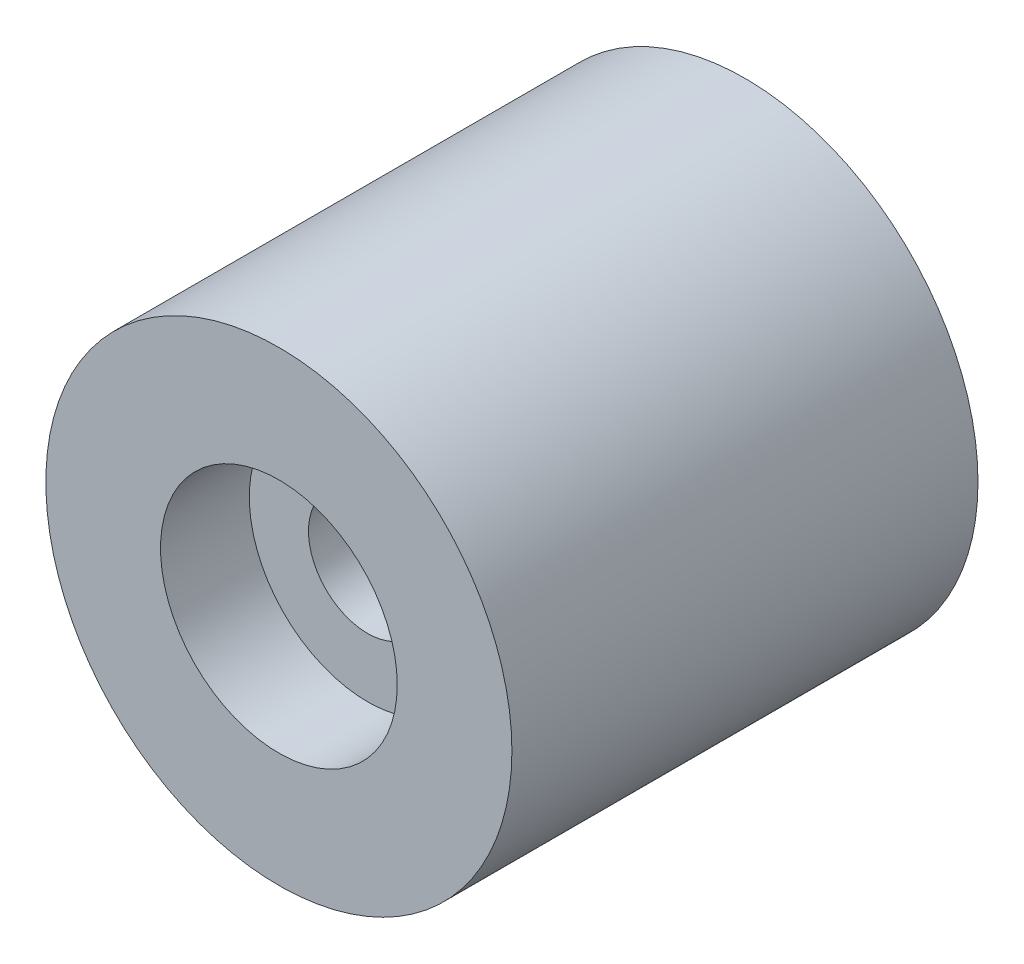
ISO-10303-21;
HEADER;
FILE_DESCRIPTION(('STEP AP214'),'2;1');
FILE_NAME('part.step','',(''),(''),'','','');
FILE_SCHEMA(('AUTOMOTIVE_DESIGN { 1 0 10303 214 1 1 1 1 }'));
ENDSEC;
DATA;
#1=APPLICATION_CONTEXT('core data for automotive mechanical design processes');
#2=APPLICATION_PROTOCOL_DEFINITION('international standard','automotive_design',2000,#1);
#3=PRODUCT_CONTEXT('',#1,'mechanical');
#4=PRODUCT('Part','Part','',(#3));
#5=PRODUCT_RELATED_PRODUCT_CATEGORY('part','',(#4));
#6=PRODUCT_DEFINITION_FORMATION('','',#4);
#7=PRODUCT_DEFINITION_CONTEXT('part definition',#1,'design');
#8=PRODUCT_DEFINITION('design','',#6,#7);
#9=PRODUCT_DEFINITION_SHAPE('','',#8);
#10=(LENGTH_UNIT() NAMED_UNIT(*) SI_UNIT(.MILLI.,.METRE.));
#11=(NAMED_UNIT(*) PLANE_ANGLE_UNIT() SI_UNIT($,.RADIAN.));
#12=(NAMED_UNIT(*) SI_UNIT($,.STERADIAN.) SOLID_ANGLE_UNIT());
#13=UNCERTAINTY_MEASURE_WITH_UNIT(LENGTH_MEASURE(1.E-05),#10,'distance_accuracy_value','');
#14=(GEOMETRIC_REPRESENTATION_CONTEXT(3) GLOBAL_UNCERTAINTY_ASSIGNED_CONTEXT((#13)) GLOBAL_UNIT_ASSIGNED_CONTEXT((#10,
#11,#12)) REPRESENTATION_CONTEXT('',''));
#15=CARTESIAN_POINT('',(0.,0.,0.));
#16=DIRECTION('',(0.,0.,1.));
#17=DIRECTION('',(1.,0.,0.));
#18=AXIS2_PLACEMENT_3D('',#15,#16,#17);
#19=CARTESIAN_POINT('',(0.,0.,15.75));
#20=DIRECTION('',(0.,0.,-1.));
#21=DIRECTION('',(-1.,0.,0.));
#22=AXIS2_PLACEMENT_3D('',#19,#20,#21);
#23=CYLINDRICAL_SURFACE('',#22,2.);
#24=CARTESIAN_POINT('',(0.,0.,0.));
#25=DIRECTION('',(0.,0.,1.));
#26=DIRECTION('',(1.,0.,0.));
#27=AXIS2_PLACEMENT_3D('',#24,#25,#26);
#28=CIRCLE('',#27,2.);
#29=CARTESIAN_POINT('',(2.,0.,0.));
#30=VERTEX_POINT('',#29);
#31=EDGE_CURVE('E50',#30,#30,#28,.T.);
#32=ORIENTED_EDGE('',*,*,#31,.F.);
#33=EDGE_LOOP('',(#32));
#34=FACE_BOUND('',#33,.T.);
#35=CARTESIAN_POINT('',(0.,0.,12.75));
#36=DIRECTION('',(0.,0.,1.));
#37=DIRECTION('',(1.,0.,0.));
#38=AXIS2_PLACEMENT_3D('',#35,#36,#37);
#39=CIRCLE('',#38,2.);
#40=CARTESIAN_POINT('',(2.,0.,12.75));
#41=VERTEX_POINT('',#40);
#42=EDGE_CURVE('E41',#41,#41,#39,.T.);
#43=ORIENTED_EDGE('',*,*,#42,.T.);
#44=EDGE_LOOP('',(#43));
#45=FACE_BOUND('',#44,.T.);
#46=ADVANCED_FACE('F37',(#34,#45),#23,.F.);
#47=CARTESIAN_POINT('',(0.,0.,15.75));
#48=DIRECTION('',(0.,0.,1.));
#49=DIRECTION('',(1.,0.,0.));
#50=AXIS2_PLACEMENT_3D('',#47,#48,#49);
#51=PLANE('',#50);
#52=CARTESIAN_POINT('',(0.,0.,15.75));
#53=DIRECTION('',(0.,0.,1.));
#54=DIRECTION('',(1.,0.,0.));
#55=AXIS2_PLACEMENT_3D('',#52,#53,#54);
#56=CIRCLE('',#55,4.);
#57=CARTESIAN_POINT('',(4.,0.,15.75));
#58=VERTEX_POINT('',#57);
#59=EDGE_CURVE('E54',#58,#58,#56,.T.);
#60=ORIENTED_EDGE('',*,*,#59,.F.);
#61=EDGE_LOOP('',(#60));
#62=FACE_BOUND('',#61,.T.);
#63=CARTESIAN_POINT('',(0.,0.,15.75));
#64=DIRECTION('',(0.,0.,1.));
#65=DIRECTION('',(1.,0.,0.));
#66=AXIS2_PLACEMENT_3D('',#63,#64,#65);
#67=CIRCLE('',#66,7.875);
#68=CARTESIAN_POINT('',(7.875,0.,15.75));
#69=VERTEX_POINT('',#68);
#70=EDGE_CURVE('E10',#69,#69,#67,.T.);
#71=ORIENTED_EDGE('',*,*,#70,.T.);
#72=EDGE_LOOP('',(#71));
#73=FACE_BOUND('',#72,.T.);
#74=ADVANCED_FACE('F75',(#62,#73),#51,.T.);
#75=CARTESIAN_POINT('',(0.,0.,0.));
#76=DIRECTION('',(0.,0.,1.));
#77=DIRECTION('',(1.,0.,0.));
#78=AXIS2_PLACEMENT_3D('',#75,#76,#77);
#79=PLANE('',#78);
#80=CARTESIAN_POINT('',(0.,0.,0.));
#81=DIRECTION('',(0.,0.,1.));
#82=DIRECTION('',(1.,0.,0.));
#83=AXIS2_PLACEMENT_3D('',#80,#81,#82);
#84=CIRCLE('',#83,7.875);
#85=CARTESIAN_POINT('',(7.875,0.,0.));
#86=VERTEX_POINT('',#85);
#87=EDGE_CURVE('E45',#86,#86,#84,.T.);
#88=ORIENTED_EDGE('',*,*,#87,.F.);
#89=EDGE_LOOP('',(#88));
#90=FACE_BOUND('',#89,.T.);
#91=ORIENTED_EDGE('',*,*,#31,.T.);
#92=EDGE_LOOP('',(#91));
#93=FACE_BOUND('',#92,.T.);
#94=ADVANCED_FACE('F82',(#90,#93),#79,.F.);
#95=CARTESIAN_POINT('',(0.,0.,15.75));
#96=DIRECTION('',(0.,0.,-1.));
#97=DIRECTION('',(-1.,0.,0.));
#98=AXIS2_PLACEMENT_3D('',#95,#96,#97);
#99=CYLINDRICAL_SURFACE('',#98,7.875);
#100=ORIENTED_EDGE('',*,*,#70,.F.);
#101=EDGE_LOOP('',(#100));
#102=FACE_BOUND('',#101,.T.);
#103=ORIENTED_EDGE('',*,*,#87,.T.);
#104=EDGE_LOOP('',(#103));
#105=FACE_BOUND('',#104,.T.);
#106=ADVANCED_FACE('F39',(#102,#105),#99,.T.);
#107=CARTESIAN_POINT('',(0.,0.,12.75));
#108=DIRECTION('',(0.,0.,1.));
#109=DIRECTION('',(1.,0.,0.));
#110=AXIS2_PLACEMENT_3D('',#107,#108,#109);
#111=CYLINDRICAL_SURFACE('',#110,4.);
#112=CARTESIAN_POINT('',(0.,0.,12.75));
#113=DIRECTION('',(0.,0.,1.));
#114=DIRECTION('',(1.,0.,0.));
#115=AXIS2_PLACEMENT_3D('',#112,#113,#114);
#116=CIRCLE('',#115,4.);
#117=CARTESIAN_POINT('',(4.,0.,12.75));
#118=VERTEX_POINT('',#117);
#119=EDGE_CURVE('E57',#118,#118,#116,.T.);
#120=ORIENTED_EDGE('',*,*,#119,.F.);
#121=EDGE_LOOP('',(#120));
#122=FACE_BOUND('',#121,.T.);
#123=ORIENTED_EDGE('',*,*,#59,.T.);
#124=EDGE_LOOP('',(#123));
#125=FACE_BOUND('',#124,.T.);
#126=ADVANCED_FACE('F67',(#122,#125),#111,.F.);
#127=CARTESIAN_POINT('',(0.,0.,12.75));
#128=DIRECTION('',(0.,0.,1.));
#129=DIRECTION('',(1.,0.,0.));
#130=AXIS2_PLACEMENT_3D('',#127,#128,#129);
#131=PLANE('',#130);
#132=ORIENTED_EDGE('',*,*,#42,.F.);
#133=EDGE_LOOP('',(#132));
#134=FACE_BOUND('',#133,.T.);
#135=ORIENTED_EDGE('',*,*,#119,.T.);
#136=EDGE_LOOP('',(#135));
#137=FACE_BOUND('',#136,.T.);
#138=ADVANCED_FACE('F65',(#134,#137),#131,.T.);
#139=CLOSED_SHELL('',(#46,#74,#94,#106,#126,#138));
#140=MANIFOLD_SOLID_BREP('B2',#139);
#141=ADVANCED_BREP_SHAPE_REPRESENTATION('',(#18,#140),#14);
#142=SHAPE_DEFINITION_REPRESENTATION(#9,#141);
ENDSEC;
END-ISO-10303-21;
